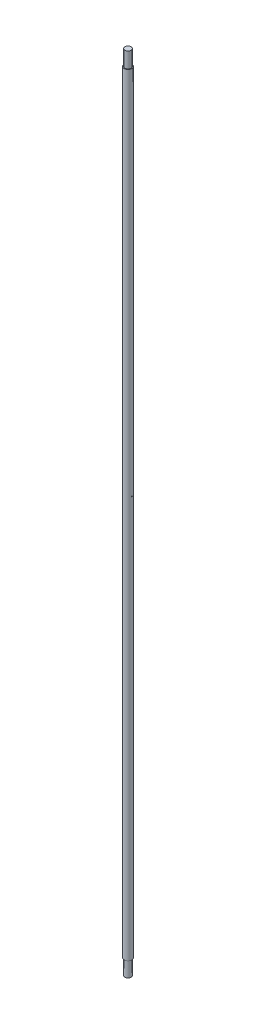
ISO-10303-21;
HEADER;
FILE_DESCRIPTION(('STEP AP214'),'2;1');
FILE_NAME('part.step','',(''),(''),'','','');
FILE_SCHEMA(('AUTOMOTIVE_DESIGN { 1 0 10303 214 1 1 1 1 }'));
ENDSEC;
DATA;
#1=APPLICATION_CONTEXT('core data for automotive mechanical design processes');
#2=APPLICATION_PROTOCOL_DEFINITION('international standard','automotive_design',2000,#1);
#3=PRODUCT_CONTEXT('',#1,'mechanical');
#4=PRODUCT('Part','Part','',(#3));
#5=PRODUCT_RELATED_PRODUCT_CATEGORY('part','',(#4));
#6=PRODUCT_DEFINITION_FORMATION('','',#4);
#7=PRODUCT_DEFINITION_CONTEXT('part definition',#1,'design');
#8=PRODUCT_DEFINITION('design','',#6,#7);
#9=PRODUCT_DEFINITION_SHAPE('','',#8);
#10=(LENGTH_UNIT() NAMED_UNIT(*) SI_UNIT(.MILLI.,.METRE.));
#11=(NAMED_UNIT(*) PLANE_ANGLE_UNIT() SI_UNIT($,.RADIAN.));
#12=(NAMED_UNIT(*) SI_UNIT($,.STERADIAN.) SOLID_ANGLE_UNIT());
#13=UNCERTAINTY_MEASURE_WITH_UNIT(LENGTH_MEASURE(1.E-05),#10,'distance_accuracy_value','');
#14=(GEOMETRIC_REPRESENTATION_CONTEXT(3) GLOBAL_UNCERTAINTY_ASSIGNED_CONTEXT((#13)) GLOBAL_UNIT_ASSIGNED_CONTEXT((#10,
#11,#12)) REPRESENTATION_CONTEXT('',''));
#15=CARTESIAN_POINT('',(0.,0.,0.));
#16=DIRECTION('',(0.,0.,1.));
#17=DIRECTION('',(1.,0.,0.));
#18=AXIS2_PLACEMENT_3D('',#15,#16,#17);
#19=CARTESIAN_POINT('',(0.,0.,0.));
#20=DIRECTION('',(0.,1.,0.));
#21=DIRECTION('',(0.,0.,1.));
#22=AXIS2_PLACEMENT_3D('',#19,#20,#21);
#23=PLANE('',#22);
#24=CARTESIAN_POINT('',(0.,0.,0.));
#25=DIRECTION('',(0.,1.,0.));
#26=DIRECTION('',(0.,0.,1.));
#27=AXIS2_PLACEMENT_3D('',#24,#25,#26);
#28=CIRCLE('',#27,5.);
#29=CARTESIAN_POINT('',(0.,0.,5.));
#30=VERTEX_POINT('',#29);
#31=EDGE_CURVE('E87',#30,#30,#28,.T.);
#32=ORIENTED_EDGE('',*,*,#31,.F.);
#33=EDGE_LOOP('',(#32));
#34=FACE_BOUND('',#33,.T.);
#35=CARTESIAN_POINT('',(0.,0.,0.));
#36=DIRECTION('',(0.,1.,0.));
#37=DIRECTION('',(0.,0.,1.));
#38=AXIS2_PLACEMENT_3D('',#35,#36,#37);
#39=CIRCLE('',#38,4.);
#40=CARTESIAN_POINT('',(0.,0.,4.));
#41=VERTEX_POINT('',#40);
#42=EDGE_CURVE('E46',#41,#41,#39,.F.);
#43=ORIENTED_EDGE('',*,*,#42,.F.);
#44=EDGE_LOOP('',(#43));
#45=FACE_BOUND('',#44,.T.);
#46=ADVANCED_FACE('F31',(#34,#45),#23,.F.);
#47=CARTESIAN_POINT('',(0.,1000.,0.));
#48=DIRECTION('',(0.,1.,0.));
#49=DIRECTION('',(0.,0.,1.));
#50=AXIS2_PLACEMENT_3D('',#47,#48,#49);
#51=PLANE('',#50);
#52=CARTESIAN_POINT('',(0.,1000.,0.));
#53=DIRECTION('',(0.,1.,0.));
#54=DIRECTION('',(0.,0.,1.));
#55=AXIS2_PLACEMENT_3D('',#52,#53,#54);
#56=CIRCLE('',#55,5.);
#57=CARTESIAN_POINT('',(0.,1000.,5.));
#58=VERTEX_POINT('',#57);
#59=EDGE_CURVE('E50',#58,#58,#56,.T.);
#60=ORIENTED_EDGE('',*,*,#59,.T.);
#61=EDGE_LOOP('',(#60));
#62=FACE_BOUND('',#61,.T.);
#63=CARTESIAN_POINT('',(0.,1000.,0.));
#64=DIRECTION('',(0.,1.,0.));
#65=DIRECTION('',(0.,0.,1.));
#66=AXIS2_PLACEMENT_3D('',#63,#64,#65);
#67=CIRCLE('',#66,4.);
#68=CARTESIAN_POINT('',(0.,1000.,4.));
#69=VERTEX_POINT('',#68);
#70=EDGE_CURVE('E95',#69,#69,#67,.T.);
#71=ORIENTED_EDGE('',*,*,#70,.F.);
#72=EDGE_LOOP('',(#71));
#73=FACE_BOUND('',#72,.T.);
#74=ADVANCED_FACE('F77',(#62,#73),#51,.T.);
#75=CARTESIAN_POINT('',(0.,1000.,0.));
#76=DIRECTION('',(0.,-1.,0.));
#77=DIRECTION('',(0.,0.,-1.));
#78=AXIS2_PLACEMENT_3D('',#75,#76,#77);
#79=CYLINDRICAL_SURFACE('',#78,5.);
#80=CARTESIAN_POINT('',(-5.,519.4,0.));
#81=CARTESIAN_POINT('',(-4.99999954714918,519.400001432788,-0.0335728094215427));
#82=CARTESIAN_POINT('',(-4.99965828400817,519.402827331739,-0.0671668634662368));
#83=CARTESIAN_POINT('',(-4.9983297410844,519.414056212831,-0.133420914261652));
#84=CARTESIAN_POINT('',(-4.99734177867456,519.42246508825,-0.166079885918023));
#85=CARTESIAN_POINT('',(-4.99483118530852,519.444609255305,-0.229494959068134));
#86=CARTESIAN_POINT('',(-4.99330890630617,519.458341041365,-0.260252297518489));
#87=CARTESIAN_POINT('',(-4.9898991852869,519.490733747017,-0.319019831566445));
#88=CARTESIAN_POINT('',(-4.98801180808282,519.509393791951,-0.347030513427071));
#89=CARTESIAN_POINT('',(-4.98407202108839,519.551214972395,-0.399658263068961));
#90=CARTESIAN_POINT('',(-4.98201890061808,519.574396168022,-0.424259338261522));
#91=CARTESIAN_POINT('',(-4.97798478794303,519.624558592978,-0.469231862076753));
#92=CARTESIAN_POINT('',(-4.97600379934136,519.651540011804,-0.489603099652986));
#93=CARTESIAN_POINT('',(-4.97233120740809,519.70864016506,-0.525596685747826));
#94=CARTESIAN_POINT('',(-4.97064051807941,519.738768344916,-0.541204151345197));
#95=CARTESIAN_POINT('',(-4.96774922689371,519.801241740422,-0.567132114603181));
#96=CARTESIAN_POINT('',(-4.96654860787596,519.833586878394,-0.577452797393596));
#97=CARTESIAN_POINT('',(-4.96478012147475,519.899410571862,-0.592465860090833));
#98=CARTESIAN_POINT('',(-4.96420922905085,519.932882905685,-0.597185155975332));
#99=CARTESIAN_POINT('',(-4.96375555381222,520.000148987273,-0.600944750439381));
#100=CARTESIAN_POINT('',(-4.96387274542064,520.033942723043,-0.599985260105738));
#101=CARTESIAN_POINT('',(-4.96477922932612,520.100705192957,-0.592436632157385));
#102=CARTESIAN_POINT('',(-4.9655649886935,520.133677327736,-0.585877086444649));
#103=CARTESIAN_POINT('',(-4.96771456175215,520.198049405564,-0.567360692340164));
#104=CARTESIAN_POINT('',(-4.96907838631375,520.229449319036,-0.555403742451654));
#105=CARTESIAN_POINT('',(-4.97223444158952,520.289877893648,-0.526399961399733));
#106=CARTESIAN_POINT('',(-4.97402775724395,520.318900295671,-0.509340212407852));
#107=CARTESIAN_POINT('',(-4.97783987975801,520.373681442183,-0.470624346338937));
#108=CARTESIAN_POINT('',(-4.97985869612425,520.399440048981,-0.448968035446313));
#109=CARTESIAN_POINT('',(-4.98391006617274,520.447134216873,-0.401509511124354));
#110=CARTESIAN_POINT('',(-4.9859426254848,520.469044393971,-0.375681780102424));
#111=CARTESIAN_POINT('',(-4.98978041597098,520.5082223042,-0.320701591787741));
#112=CARTESIAN_POINT('',(-4.99158564668842,520.525490028004,-0.291549127816009));
#113=CARTESIAN_POINT('',(-4.99476637723403,520.554892657128,-0.230727861652566));
#114=CARTESIAN_POINT('',(-4.99614174945619,520.567026038666,-0.199058315743113));
#115=CARTESIAN_POINT('',(-4.9983066130618,520.58579574757,-0.134111204454688));
#116=CARTESIAN_POINT('',(-4.99909612971168,520.592432312001,-0.100833708488334));
#117=CARTESIAN_POINT('',(-4.99999705000608,520.5999872511,-0.0338348792748554));
#118=CARTESIAN_POINT('',(-5.00011260187505,520.60094060648,-0.000117544086416138));
#119=CARTESIAN_POINT('',(-4.99966375646462,520.597194284426,0.066996413648658));
#120=CARTESIAN_POINT('',(-4.99909937250615,520.592494717741,0.100393042465477));
#121=CARTESIAN_POINT('',(-4.99735666761372,520.577605007199,0.165814852785696));
#122=CARTESIAN_POINT('',(-4.99618020475817,520.56743147739,0.197843869273839));
#123=CARTESIAN_POINT('',(-4.99334511003585,520.541899859329,0.25974107953733));
#124=CARTESIAN_POINT('',(-4.99168646297517,520.526541607702,0.289609205184732));
#125=CARTESIAN_POINT('',(-4.98806170317389,520.490991416819,0.34649343553306));
#126=CARTESIAN_POINT('',(-4.98609416169286,520.470776772438,0.373495257925568));
#127=CARTESIAN_POINT('',(-4.98207635838838,520.426119830718,0.423735250304479));
#128=CARTESIAN_POINT('',(-4.98002609354968,520.40167737917,0.446973282945963));
#129=CARTESIAN_POINT('',(-4.97606118969884,520.349104876914,0.489149590452365));
#130=CARTESIAN_POINT('',(-4.97414731662614,520.320956196931,0.508064726463939));
#131=CARTESIAN_POINT('',(-4.97068429986766,520.261860994985,0.54089862885872));
#132=CARTESIAN_POINT('',(-4.96913514935885,520.230914525376,0.554817488712194));
#133=CARTESIAN_POINT('',(-4.96658211469004,520.167177878221,0.577225993336352));
#134=CARTESIAN_POINT('',(-4.96557690551265,520.134392397628,0.585728840318726));
#135=CARTESIAN_POINT('',(-4.96422170549173,520.067846206103,0.597106544327071));
#136=CARTESIAN_POINT('',(-4.96387168674212,520.034085536769,0.599981641052202));
#137=CARTESIAN_POINT('',(-4.96386726532138,519.966777454073,0.600018067635912));
#138=CARTESIAN_POINT('',(-4.96420843727886,519.933230054846,0.597215747342753));
#139=CARTESIAN_POINT('',(-4.9655384589485,519.867086642721,0.586053697344213));
#140=CARTESIAN_POINT('',(-4.96652730889313,519.834490630165,0.577693965644158));
#141=CARTESIAN_POINT('',(-4.96903993049172,519.771179092222,0.5556654796411));
#142=CARTESIAN_POINT('',(-4.97056354033625,519.740463001301,0.541998331141091));
#143=CARTESIAN_POINT('',(-4.97397429078277,519.681754450586,0.509746565256069));
#144=CARTESIAN_POINT('',(-4.97586143452305,519.653762014308,0.491161905418975));
#145=CARTESIAN_POINT('',(-4.97980110245174,519.601109411978,0.449467379294538));
#146=CARTESIAN_POINT('',(-4.98185457162693,519.576470779347,0.426330407860432));
#147=CARTESIAN_POINT('',(-4.98588709936338,519.531411504087,0.376244186668991));
#148=CARTESIAN_POINT('',(-4.98786614021019,519.510991860474,0.349294036527256));
#149=CARTESIAN_POINT('',(-4.99153443418649,519.4748898844,0.292238644930294));
#150=CARTESIAN_POINT('',(-4.99322264432419,519.459224454856,0.262122646924866));
#151=CARTESIAN_POINT('',(-4.99610837039453,519.433195247111,0.199684550337071));
#152=CARTESIAN_POINT('',(-4.9973064236123,519.422825660764,0.167364912872405));
#153=CARTESIAN_POINT('',(-4.99878536651998,519.410187315932,0.112395420247301));
#154=CARTESIAN_POINT('',(-4.99923865588659,519.406372503223,0.0900933139506674));
#155=CARTESIAN_POINT('',(-4.99984612408408,519.401278371302,0.0451973471387232));
#156=CARTESIAN_POINT('',(-5.00000030488983,519.39999903535,0.0226034885507157));
#157=CARTESIAN_POINT('',(-5.,519.4,0.));
#158=B_SPLINE_CURVE_WITH_KNOTS('',3,(#80,#81,#82,#83,#84,#85,#86,#87,#88,#89,#90,#91,#92,#93,
#94,#95,#96,#97,#98,#99,#100,#101,#102,#103,#104,#105,#106,#107,#108,#109,#110,#111,#112,#113,
#114,#115,#116,#117,#118,#119,#120,#121,#122,#123,#124,#125,#126,#127,#128,#129,#130,#131,#132,
#133,#134,#135,#136,#137,#138,#139,#140,#141,#142,#143,#144,#145,#146,#147,#148,#149,#150,#151,
#152,#153,#154,#155,#156,#157),.UNSPECIFIED.,.T.,.F.,(4,2,2,2,2,2,2,2,2,2,2,2,2,2,2,2,2,2,2,2,2,
2,2,2,2,2,2,2,2,2,2,2,2,2,2,2,2,2,4),(0.,0.100635870191236,0.201378138817259,0.302054172751167,
0.402712350883441,0.503827744391839,0.604948181809808,0.706381378992837,0.807811023998236,
0.908751276686611,1.00968777733695,1.11009418582461,1.21050248250693,1.3111671474212,
1.41183605773869,1.51314588928071,1.61445592434534,1.71579600538869,1.81713171564535,
1.91784304524858,2.0185524018023,2.11895780511567,2.21936637260354,2.32025384357137,
2.42114499520737,2.52256415163364,2.6239814106128,2.72515049652993,2.82631527332322,
2.92683438638486,3.02735353552499,3.127842295428,3.22833192286255,3.32943904804077,
3.43057008704039,3.53205658047917,3.63343152958579,3.70118685891283,3.76894174087988),.UNSPECIFIED.);
#159=CARTESIAN_POINT('',(-5.,519.4,0.));
#160=VERTEX_POINT('',#159);
#161=EDGE_CURVE('E10',#160,#160,#158,.T.);
#162=ORIENTED_EDGE('',*,*,#161,.T.);
#163=EDGE_LOOP('',(#162));
#164=FACE_BOUND('',#163,.T.);
#165=CARTESIAN_POINT('',(4.96386945839634,520.,-0.600000000000045));
#166=CARTESIAN_POINT('',(4.96386992356669,519.966428171762,-0.599998566345599));
#167=CARTESIAN_POINT('',(4.96421371576855,519.932835095976,-0.597172826992718));
#168=CARTESIAN_POINT('',(4.96555129020865,519.866583077594,-0.585944637419323));
#169=CARTESIAN_POINT('',(4.96654575971933,519.833925160864,-0.577536290478083));
#170=CARTESIAN_POINT('',(4.96907046210477,519.770512318897,-0.555393669231715));
#171=CARTESIAN_POINT('',(4.97060033974719,519.739756147773,-0.54166292557953));
#172=CARTESIAN_POINT('',(4.97402304999376,519.68099057158,-0.509272675115884));
#173=CARTESIAN_POINT('',(4.97591581835864,519.652980681686,-0.49061404042401));
#174=CARTESIAN_POINT('',(4.97986200109296,519.600352045678,-0.448794287860049));
#175=CARTESIAN_POINT('',(4.98191611633016,519.57574954113,-0.42561279450127));
#176=CARTESIAN_POINT('',(4.98594723170915,519.530774256368,-0.375449172869737));
#177=CARTESIAN_POINT('',(4.98792422807937,519.510401682812,-0.348466859010806));
#178=CARTESIAN_POINT('',(4.99158548046123,519.474406693413,-0.291365913693567));
#179=CARTESIAN_POINT('',(4.99326882761331,519.458798916852,-0.261237990769763));
#180=CARTESIAN_POINT('',(4.99614542486483,519.432870307923,-0.198765153454511));
#181=CARTESIAN_POINT('',(4.99733869178934,519.42254929405,-0.166420315217061));
#182=CARTESIAN_POINT('',(4.99909574649051,519.407535548779,-0.100597571396966));
#183=CARTESIAN_POINT('',(4.99966254728816,519.402815869311,-0.0671258942086247));
#184=CARTESIAN_POINT('',(5.00011308732203,519.399055280138,0.000138899333756769));
#185=CARTESIAN_POINT('',(4.99999685144069,519.400014163568,0.0339320039337036));
#186=CARTESIAN_POINT('',(4.99909685850532,519.40756182437,0.100697133503553));
#187=CARTESIAN_POINT('',(4.99831653768676,519.414121620994,0.133672487513708));
#188=CARTESIAN_POINT('',(4.99617992844761,519.432639630343,0.198050874018295));
#189=CARTESIAN_POINT('',(4.99482362980931,519.444597938836,0.229453878608555));
#190=CARTESIAN_POINT('',(4.99168155809107,519.473604545781,0.289886224651903));
#191=CARTESIAN_POINT('',(4.98989472377384,519.490665447201,0.318909459455124));
#192=CARTESIAN_POINT('',(4.98609161934321,519.529383779791,0.373691784039812));
#193=CARTESIAN_POINT('',(4.98407533953191,519.551041405283,0.399450735753419));
#194=CARTESIAN_POINT('',(4.98002413490591,519.598500869908,0.447143442246156));
#195=CARTESIAN_POINT('',(4.97798917265083,519.624327956275,0.469052077756845));
#196=CARTESIAN_POINT('',(4.97414252092148,519.679306302736,0.508227183650424));
#197=CARTESIAN_POINT('',(4.97233083205189,519.708457571833,0.525493641461151));
#198=CARTESIAN_POINT('',(4.9691358411043,519.76927849803,0.554895356717367));
#199=CARTESIAN_POINT('',(4.96775269869133,519.800949088252,0.567028702315338));
#200=CARTESIAN_POINT('',(4.96557456613222,519.8658984719,0.585798020064802));
#201=CARTESIAN_POINT('',(4.96477954993463,519.899177194024,0.592434235717149));
#202=CARTESIAN_POINT('',(4.96387240031273,519.966176619275,0.59998785742438));
#203=CARTESIAN_POINT('',(4.96375605121267,519.999893287176,0.600940568541592));
#204=CARTESIAN_POINT('',(4.96420826602291,520.067005756169,0.597193196111248));
#205=CARTESIAN_POINT('',(4.96477681650601,520.100401563538,0.592493223382537));
#206=CARTESIAN_POINT('',(4.96653092549957,520.16581915672,0.57760358388407));
#207=CARTESIAN_POINT('',(4.96771457204316,520.197844869362,0.567430924997904));
#208=CARTESIAN_POINT('',(4.97056395706496,520.259735856595,0.541902153585278));
#209=CARTESIAN_POINT('',(4.97222971121827,520.289601060901,0.526545872517266));
#210=CARTESIAN_POINT('',(4.97586574626598,520.346483258995,0.490998605443264));
#211=CARTESIAN_POINT('',(4.97783747219711,520.373485657376,0.470784414282977));
#212=CARTESIAN_POINT('',(4.98185871080738,520.423727022602,0.426128035673407));
#213=CARTESIAN_POINT('',(4.98390822626877,520.446965854681,0.401685696887222));
#214=CARTESIAN_POINT('',(4.98786701889821,520.489143949447,0.349112854533511));
#215=CARTESIAN_POINT('',(4.98977550512061,520.508060049302,0.320963699883528));
#216=CARTESIAN_POINT('',(4.9932254486232,520.540895641866,0.261867285882084));
#217=CARTESIAN_POINT('',(4.99476691280075,520.554815228475,0.230920079128862));
#218=CARTESIAN_POINT('',(4.99730560861028,520.577224200975,0.167183848943993));
#219=CARTESIAN_POINT('',(4.99830419405257,520.585727103977,0.13439963412944));
#220=CARTESIAN_POINT('',(4.99965022729014,520.597105348716,0.0678561169983067));
#221=CARTESIAN_POINT('',(4.99999770203132,520.599980923339,0.0340968550922629));
#222=CARTESIAN_POINT('',(5.00000226097294,520.600018768823,-0.0332120012511312));
#223=CARTESIAN_POINT('',(4.99966366730498,520.597216807337,-0.0667615809317834));
#224=CARTESIAN_POINT('',(4.99834270804142,520.58605470902,-0.13290944495927));
#225=CARTESIAN_POINT('',(4.99736034265685,520.57769457401,-0.165507729617926));
#226=CARTESIAN_POINT('',(4.99486176038979,520.555664396974,-0.228823911196758));
#227=CARTESIAN_POINT('',(4.99334570158299,520.541995927109,-0.259542361749635));
#228=CARTESIAN_POINT('',(4.98994784886322,520.509740786083,-0.318255082105092));
#229=CARTESIAN_POINT('',(4.98806605199043,520.491154075119,-0.346249329858762));
#230=CARTESIAN_POINT('',(4.98413278724526,520.449457263599,-0.398901896849741));
#231=CARTESIAN_POINT('',(4.98208036352183,520.426320528935,-0.423539053575398));
#232=CARTESIAN_POINT('',(4.97804493729181,520.37623539257,-0.468595461424858));
#233=CARTESIAN_POINT('',(4.97606195138489,520.3492860871,-0.489013709626201));
#234=CARTESIAN_POINT('',(4.97238238415055,520.292231412766,-0.525114149457515));
#235=CARTESIAN_POINT('',(4.97068684912818,520.262115134345,-0.540779196400647));
#236=CARTESIAN_POINT('',(4.96778644753479,520.19967644925,-0.566807611647531));
#237=CARTESIAN_POINT('',(4.96658104327924,520.16735650576,-0.577176792852118));
#238=CARTESIAN_POINT('',(4.96509254473975,520.112388092179,-0.589814020147341));
#239=CARTESIAN_POINT('',(4.96463614619901,520.090087449608,-0.593628329883947));
#240=CARTESIAN_POINT('',(4.9640244474611,520.045194413573,-0.598721793819064));
#241=CARTESIAN_POINT('',(4.96386914522332,520.022602022088,-0.600000965198879));
#242=CARTESIAN_POINT('',(4.96386945839634,520.,-0.600000000000045));
#243=B_SPLINE_CURVE_WITH_KNOTS('',3,(#165,#166,#167,#168,#169,#170,#171,#172,#173,#174,#175,
#176,#177,#178,#179,#180,#181,#182,#183,#184,#185,#186,#187,#188,#189,#190,#191,#192,#193,#194,
#195,#196,#197,#198,#199,#200,#201,#202,#203,#204,#205,#206,#207,#208,#209,#210,#211,#212,#213,
#214,#215,#216,#217,#218,#219,#220,#221,#222,#223,#224,#225,#226,#227,#228,#229,#230,#231,#232,
#233,#234,#235,#236,#237,#238,#239,#240,#241,#242),.UNSPECIFIED.,.T.,.F.,(4,2,2,2,2,2,2,2,2,2,2,
2,2,2,2,2,2,2,2,2,2,2,2,2,2,2,2,2,2,2,2,2,2,2,2,2,2,2,4),(0.,0.100632922643768,0.20137230992772,
0.302044985009003,0.402699855344522,0.50381910664166,0.604943297094562,0.706375123507198,
0.807803467345909,0.908741834432334,1.00967652444536,1.11009209231751,1.21050944161347,
1.31117689071066,1.41184859627183,1.51315448881786,1.61446065572247,1.7158045213533,
1.81714389761644,1.91785310817276,2.01856034439318,2.11895639793263,2.21935571608826,
2.32024450062146,2.42113689698609,2.52255785859078,2.62397691406392,2.72514188068215,
2.82630266054792,2.92682812375654,3.02735355401399,3.12784923446623,3.2283457282338,
3.32944900824788,3.43057629503669,3.53206412432359,3.63344031682412,3.70119125785985,
3.76894173972792),.UNSPECIFIED.);
#244=CARTESIAN_POINT('',(4.96386945839634,520.,-0.600000000000045));
#245=VERTEX_POINT('',#244);
#246=EDGE_CURVE('E42',#245,#245,#243,.T.);
#247=ORIENTED_EDGE('',*,*,#246,.T.);
#248=EDGE_LOOP('',(#247));
#249=FACE_BOUND('',#248,.T.);
#250=ORIENTED_EDGE('',*,*,#59,.F.);
#251=EDGE_LOOP('',(#250));
#252=FACE_BOUND('',#251,.T.);
#253=ORIENTED_EDGE('',*,*,#31,.T.);
#254=EDGE_LOOP('',(#253));
#255=FACE_BOUND('',#254,.T.);
#256=ADVANCED_FACE('F33',(#164,#249,#252,#255),#79,.T.);
#257=CARTESIAN_POINT('',(0.,1020.,0.));
#258=DIRECTION('',(0.,-1.,0.));
#259=DIRECTION('',(0.,0.,-1.));
#260=AXIS2_PLACEMENT_3D('',#257,#258,#259);
#261=CYLINDRICAL_SURFACE('',#260,4.);
#262=CARTESIAN_POINT('',(0.,1020.,0.));
#263=DIRECTION('',(0.,1.,0.));
#264=DIRECTION('',(0.,0.,1.));
#265=AXIS2_PLACEMENT_3D('',#262,#263,#264);
#266=CIRCLE('',#265,4.);
#267=CARTESIAN_POINT('',(0.,1020.,4.));
#268=VERTEX_POINT('',#267);
#269=EDGE_CURVE('E91',#268,#268,#266,.T.);
#270=ORIENTED_EDGE('',*,*,#269,.F.);
#271=EDGE_LOOP('',(#270));
#272=FACE_BOUND('',#271,.T.);
#273=ORIENTED_EDGE('',*,*,#70,.T.);
#274=EDGE_LOOP('',(#273));
#275=FACE_BOUND('',#274,.T.);
#276=ADVANCED_FACE('F72',(#272,#275),#261,.T.);
#277=CARTESIAN_POINT('',(0.,1020.,0.));
#278=DIRECTION('',(0.,1.,0.));
#279=DIRECTION('',(0.,0.,1.));
#280=AXIS2_PLACEMENT_3D('',#277,#278,#279);
#281=PLANE('',#280);
#282=ORIENTED_EDGE('',*,*,#269,.T.);
#283=EDGE_LOOP('',(#282));
#284=FACE_BOUND('',#283,.T.);
#285=ADVANCED_FACE('F68',(#284),#281,.T.);
#286=CARTESIAN_POINT('',(0.,-20.,0.));
#287=DIRECTION('',(0.,1.,0.));
#288=DIRECTION('',(0.,0.,1.));
#289=AXIS2_PLACEMENT_3D('',#286,#287,#288);
#290=CYLINDRICAL_SURFACE('',#289,4.);
#291=CARTESIAN_POINT('',(0.,-20.,0.));
#292=DIRECTION('',(0.,-1.,0.));
#293=DIRECTION('',(0.,0.,-1.));
#294=AXIS2_PLACEMENT_3D('',#291,#292,#293);
#295=CIRCLE('',#294,4.);
#296=CARTESIAN_POINT('',(0.,-20.,-4.));
#297=VERTEX_POINT('',#296);
#298=EDGE_CURVE('E99',#297,#297,#295,.T.);
#299=ORIENTED_EDGE('',*,*,#298,.F.);
#300=EDGE_LOOP('',(#299));
#301=FACE_BOUND('',#300,.T.);
#302=ORIENTED_EDGE('',*,*,#42,.T.);
#303=EDGE_LOOP('',(#302));
#304=FACE_BOUND('',#303,.T.);
#305=ADVANCED_FACE('F64',(#301,#304),#290,.T.);
#306=CARTESIAN_POINT('',(0.,-20.,0.));
#307=DIRECTION('',(0.,-1.,0.));
#308=DIRECTION('',(0.,0.,-1.));
#309=AXIS2_PLACEMENT_3D('',#306,#307,#308);
#310=PLANE('',#309);
#311=ORIENTED_EDGE('',*,*,#298,.T.);
#312=EDGE_LOOP('',(#311));
#313=FACE_BOUND('',#312,.T.);
#314=ADVANCED_FACE('F59',(#313),#310,.T.);
#315=CARTESIAN_POINT('',(5.,520.,0.));
#316=DIRECTION('',(1.,0.,0.));
#317=DIRECTION('',(0.,0.,-1.));
#318=AXIS2_PLACEMENT_3D('',#315,#316,#317);
#319=CYLINDRICAL_SURFACE('',#318,0.600000000000045);
#320=ORIENTED_EDGE('',*,*,#246,.F.);
#321=EDGE_LOOP('',(#320));
#322=FACE_BOUND('',#321,.T.);
#323=ORIENTED_EDGE('',*,*,#161,.F.);
#324=EDGE_LOOP('',(#323));
#325=FACE_BOUND('',#324,.T.);
#326=ADVANCED_FACE('F55',(#322,#325),#319,.F.);
#327=CLOSED_SHELL('',(#46,#74,#256,#276,#285,#305,#314,#326));
#328=MANIFOLD_SOLID_BREP('B2',#327);
#329=ADVANCED_BREP_SHAPE_REPRESENTATION('',(#18,#328),#14);
#330=SHAPE_DEFINITION_REPRESENTATION(#9,#329);
ENDSEC;
END-ISO-10303-21;
